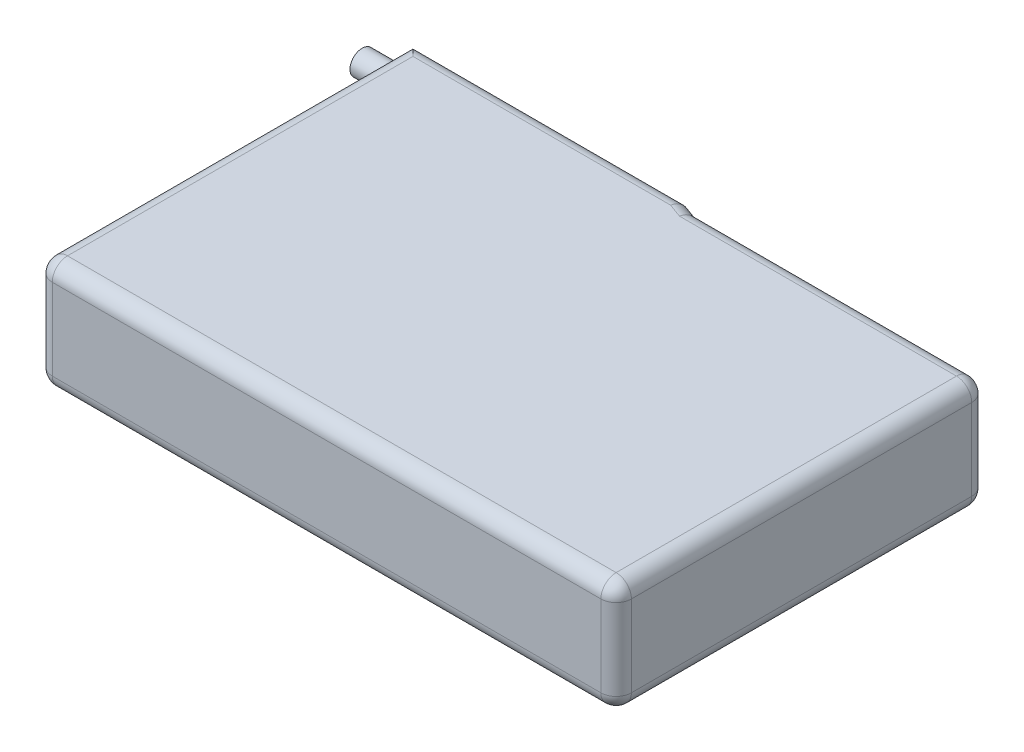
ISO-10303-21;
HEADER;
FILE_DESCRIPTION(('STEP AP214'),'2;1');
FILE_NAME('part.step','',(''),(''),'','','');
FILE_SCHEMA(('AUTOMOTIVE_DESIGN { 1 0 10303 214 1 1 1 1 }'));
ENDSEC;
DATA;
#1=APPLICATION_CONTEXT('core data for automotive mechanical design processes');
#2=APPLICATION_PROTOCOL_DEFINITION('international standard','automotive_design',2000,#1);
#3=PRODUCT_CONTEXT('',#1,'mechanical');
#4=PRODUCT('Part','Part','',(#3));
#5=PRODUCT_RELATED_PRODUCT_CATEGORY('part','',(#4));
#6=PRODUCT_DEFINITION_FORMATION('','',#4);
#7=PRODUCT_DEFINITION_CONTEXT('part definition',#1,'design');
#8=PRODUCT_DEFINITION('design','',#6,#7);
#9=PRODUCT_DEFINITION_SHAPE('','',#8);
#10=(LENGTH_UNIT() NAMED_UNIT(*) SI_UNIT(.MILLI.,.METRE.));
#11=(NAMED_UNIT(*) PLANE_ANGLE_UNIT() SI_UNIT($,.RADIAN.));
#12=(NAMED_UNIT(*) SI_UNIT($,.STERADIAN.) SOLID_ANGLE_UNIT());
#13=UNCERTAINTY_MEASURE_WITH_UNIT(LENGTH_MEASURE(1.E-05),#10,'distance_accuracy_value','');
#14=(GEOMETRIC_REPRESENTATION_CONTEXT(3) GLOBAL_UNCERTAINTY_ASSIGNED_CONTEXT((#13)) GLOBAL_UNIT_ASSIGNED_CONTEXT((#10,
#11,#12)) REPRESENTATION_CONTEXT('',''));
#15=CARTESIAN_POINT('',(0.,0.,0.));
#16=DIRECTION('',(0.,0.,1.));
#17=DIRECTION('',(1.,0.,0.));
#18=AXIS2_PLACEMENT_3D('',#15,#16,#17);
#19=CARTESIAN_POINT('',(-28.5,11.,18.25));
#20=DIRECTION('',(1.,0.,0.));
#21=DIRECTION('',(0.,0.,-1.));
#22=AXIS2_PLACEMENT_3D('',#19,#20,#21);
#23=PLANE('',#22);
#24=CARTESIAN_POINT('',(-28.5,5.5,-16.75));
#25=DIRECTION('',(1.,0.,0.));
#26=DIRECTION('',(0.,0.,-1.));
#27=AXIS2_PLACEMENT_3D('',#24,#25,#26);
#28=CIRCLE('',#27,1.2);
#29=CARTESIAN_POINT('',(-28.5,5.5,-17.95));
#30=VERTEX_POINT('',#29);
#31=EDGE_CURVE('E194',#30,#30,#28,.F.);
#32=ORIENTED_EDGE('',*,*,#31,.F.);
#33=EDGE_LOOP('',(#32));
#34=FACE_BOUND('',#33,.T.);
#35=DIRECTION('',(0.,1.,0.));
#36=VECTOR('',#35,1.);
#37=CARTESIAN_POINT('',(-28.5,0.,-18.75));
#38=LINE('',#37,#36);
#39=CARTESIAN_POINT('',(-28.5,1.5,-18.75));
#40=VERTEX_POINT('',#39);
#41=CARTESIAN_POINT('',(-28.5,9.5,-18.75));
#42=VERTEX_POINT('',#41);
#43=EDGE_CURVE('E216',#40,#42,#38,.T.);
#44=ORIENTED_EDGE('',*,*,#43,.F.);
#45=DIRECTION('',(0.,0.,1.));
#46=VECTOR('',#45,1.);
#47=CARTESIAN_POINT('',(-28.5,1.5,18.25));
#48=LINE('',#47,#46);
#49=CARTESIAN_POINT('',(-28.5,1.5,-17.4133249580711));
#50=VERTEX_POINT('',#49);
#51=EDGE_CURVE('E209',#40,#50,#48,.T.);
#52=ORIENTED_EDGE('',*,*,#51,.T.);
#53=CARTESIAN_POINT('',(-28.5,2.5,-16.75));
#54=DIRECTION('',(1.,0.,0.));
#55=DIRECTION('',(0.,0.,-1.));
#56=AXIS2_PLACEMENT_3D('',#53,#54,#55);
#57=CIRCLE('',#56,1.2);
#58=CARTESIAN_POINT('',(-28.5,1.5,-16.0866750419289));
#59=VERTEX_POINT('',#58);
#60=EDGE_CURVE('E191',#59,#50,#57,.F.);
#61=ORIENTED_EDGE('',*,*,#60,.F.);
#62=DIRECTION('',(0.,0.,1.));
#63=VECTOR('',#62,1.);
#64=CARTESIAN_POINT('',(-28.5,1.5,18.25));
#65=LINE('',#64,#63);
#66=CARTESIAN_POINT('',(-28.5,1.5,16.75));
#67=VERTEX_POINT('',#66);
#68=EDGE_CURVE('E207',#59,#67,#65,.T.);
#69=ORIENTED_EDGE('',*,*,#68,.T.);
#70=DIRECTION('',(0.,-1.,0.));
#71=VECTOR('',#70,1.);
#72=CARTESIAN_POINT('',(-28.5,11.,16.75));
#73=LINE('',#72,#71);
#74=CARTESIAN_POINT('',(-28.5,9.5,16.75));
#75=VERTEX_POINT('',#74);
#76=EDGE_CURVE('E204',#67,#75,#73,.F.);
#77=ORIENTED_EDGE('',*,*,#76,.T.);
#78=DIRECTION('',(0.,0.,1.));
#79=VECTOR('',#78,1.);
#80=CARTESIAN_POINT('',(-28.5,9.5,-18.75));
#81=LINE('',#80,#79);
#82=CARTESIAN_POINT('',(-28.5,9.5,-16.0866750419289));
#83=VERTEX_POINT('',#82);
#84=EDGE_CURVE('E202',#75,#83,#81,.F.);
#85=ORIENTED_EDGE('',*,*,#84,.T.);
#86=CARTESIAN_POINT('',(-28.5,8.5,-16.75));
#87=DIRECTION('',(1.,0.,0.));
#88=DIRECTION('',(0.,0.,-1.));
#89=AXIS2_PLACEMENT_3D('',#86,#87,#88);
#90=CIRCLE('',#89,1.2);
#91=CARTESIAN_POINT('',(-28.5,9.5,-17.4133249580711));
#92=VERTEX_POINT('',#91);
#93=EDGE_CURVE('E226',#92,#83,#90,.F.);
#94=ORIENTED_EDGE('',*,*,#93,.F.);
#95=DIRECTION('',(0.,0.,1.));
#96=VECTOR('',#95,1.);
#97=CARTESIAN_POINT('',(-28.5,9.5,-18.75));
#98=LINE('',#97,#96);
#99=EDGE_CURVE('E200',#92,#42,#98,.F.);
#100=ORIENTED_EDGE('',*,*,#99,.T.);
#101=EDGE_LOOP('',(#44,#52,#61,#69,#77,#85,#94,#100));
#102=FACE_BOUND('',#101,.T.);
#103=ADVANCED_FACE('F32',(#34,#102),#23,.F.);
#104=CARTESIAN_POINT('',(28.5,11.,-18.25));
#105=DIRECTION('',(0.,0.,1.));
#106=DIRECTION('',(1.,0.,0.));
#107=AXIS2_PLACEMENT_3D('',#104,#105,#106);
#108=PLANE('',#107);
#109=DIRECTION('',(0.,-1.,0.));
#110=VECTOR('',#109,1.);
#111=CARTESIAN_POINT('',(27.,11.,-18.25));
#112=LINE('',#111,#110);
#113=CARTESIAN_POINT('',(27.,9.5,-18.25));
#114=VERTEX_POINT('',#113);
#115=CARTESIAN_POINT('',(27.,1.5,-18.25));
#116=VERTEX_POINT('',#115);
#117=EDGE_CURVE('E516',#114,#116,#112,.T.);
#118=ORIENTED_EDGE('',*,*,#117,.T.);
#119=DIRECTION('',(-1.,0.,0.));
#120=VECTOR('',#119,1.);
#121=CARTESIAN_POINT('',(28.5,1.5,-18.25));
#122=LINE('',#121,#120);
#123=CARTESIAN_POINT('',(0.,1.5,-18.25));
#124=VERTEX_POINT('',#123);
#125=EDGE_CURVE('E514',#116,#124,#122,.T.);
#126=ORIENTED_EDGE('',*,*,#125,.T.);
#127=DIRECTION('',(0.,-1.,0.));
#128=VECTOR('',#127,1.);
#129=CARTESIAN_POINT('',(0.,0.,-18.25));
#130=LINE('',#129,#128);
#131=CARTESIAN_POINT('',(0.,9.5,-18.25));
#132=VERTEX_POINT('',#131);
#133=EDGE_CURVE('E212',#132,#124,#130,.T.);
#134=ORIENTED_EDGE('',*,*,#133,.F.);
#135=DIRECTION('',(-1.,0.,0.));
#136=VECTOR('',#135,1.);
#137=CARTESIAN_POINT('',(28.5,9.5,-18.25));
#138=LINE('',#137,#136);
#139=EDGE_CURVE('E211',#132,#114,#138,.F.);
#140=ORIENTED_EDGE('',*,*,#139,.T.);
#141=EDGE_LOOP('',(#118,#126,#134,#140));
#142=FACE_BOUND('',#141,.T.);
#143=ADVANCED_FACE('F235',(#142),#108,.F.);
#144=CARTESIAN_POINT('',(28.5,11.,18.25));
#145=DIRECTION('',(0.,0.,-1.));
#146=DIRECTION('',(-1.,0.,0.));
#147=AXIS2_PLACEMENT_3D('',#144,#145,#146);
#148=PLANE('',#147);
#149=DIRECTION('',(0.,-1.,0.));
#150=VECTOR('',#149,1.);
#151=CARTESIAN_POINT('',(-27.,11.,18.25));
#152=LINE('',#151,#150);
#153=CARTESIAN_POINT('',(-27.,9.5,18.25));
#154=VERTEX_POINT('',#153);
#155=CARTESIAN_POINT('',(-27.,1.5,18.25));
#156=VERTEX_POINT('',#155);
#157=EDGE_CURVE('E165',#154,#156,#152,.T.);
#158=ORIENTED_EDGE('',*,*,#157,.T.);
#159=DIRECTION('',(1.,0.,0.));
#160=VECTOR('',#159,1.);
#161=CARTESIAN_POINT('',(28.5,1.5,18.25));
#162=LINE('',#161,#160);
#163=CARTESIAN_POINT('',(27.,1.5,18.25));
#164=VERTEX_POINT('',#163);
#165=EDGE_CURVE('E161',#156,#164,#162,.T.);
#166=ORIENTED_EDGE('',*,*,#165,.T.);
#167=DIRECTION('',(0.,-1.,0.));
#168=VECTOR('',#167,1.);
#169=CARTESIAN_POINT('',(27.,11.,18.25));
#170=LINE('',#169,#168);
#171=CARTESIAN_POINT('',(27.,9.5,18.25));
#172=VERTEX_POINT('',#171);
#173=EDGE_CURVE('E153',#164,#172,#170,.F.);
#174=ORIENTED_EDGE('',*,*,#173,.T.);
#175=DIRECTION('',(1.,0.,0.));
#176=VECTOR('',#175,1.);
#177=CARTESIAN_POINT('',(-28.5,9.5,18.25));
#178=LINE('',#177,#176);
#179=EDGE_CURVE('E158',#172,#154,#178,.F.);
#180=ORIENTED_EDGE('',*,*,#179,.T.);
#181=EDGE_LOOP('',(#158,#166,#174,#180));
#182=FACE_BOUND('',#181,.T.);
#183=ADVANCED_FACE('F156',(#182),#148,.F.);
#184=CARTESIAN_POINT('',(28.5,11.,18.25));
#185=DIRECTION('',(-1.,0.,0.));
#186=DIRECTION('',(0.,0.,1.));
#187=AXIS2_PLACEMENT_3D('',#184,#185,#186);
#188=PLANE('',#187);
#189=DIRECTION('',(0.,-1.,0.));
#190=VECTOR('',#189,1.);
#191=CARTESIAN_POINT('',(28.5,11.,16.75));
#192=LINE('',#191,#190);
#193=CARTESIAN_POINT('',(28.5,9.5,16.75));
#194=VERTEX_POINT('',#193);
#195=CARTESIAN_POINT('',(28.5,1.5,16.75));
#196=VERTEX_POINT('',#195);
#197=EDGE_CURVE('E172',#194,#196,#192,.T.);
#198=ORIENTED_EDGE('',*,*,#197,.T.);
#199=DIRECTION('',(0.,0.,-1.));
#200=VECTOR('',#199,1.);
#201=CARTESIAN_POINT('',(28.5,1.5,18.25));
#202=LINE('',#201,#200);
#203=CARTESIAN_POINT('',(28.5,1.5,-16.75));
#204=VERTEX_POINT('',#203);
#205=EDGE_CURVE('E416',#196,#204,#202,.T.);
#206=ORIENTED_EDGE('',*,*,#205,.T.);
#207=DIRECTION('',(0.,-1.,0.));
#208=VECTOR('',#207,1.);
#209=CARTESIAN_POINT('',(28.5,11.,-16.75));
#210=LINE('',#209,#208);
#211=CARTESIAN_POINT('',(28.5,9.5,-16.75));
#212=VERTEX_POINT('',#211);
#213=EDGE_CURVE('E420',#204,#212,#210,.F.);
#214=ORIENTED_EDGE('',*,*,#213,.T.);
#215=DIRECTION('',(0.,0.,-1.));
#216=VECTOR('',#215,1.);
#217=CARTESIAN_POINT('',(28.5,9.5,18.25));
#218=LINE('',#217,#216);
#219=EDGE_CURVE('E517',#212,#194,#218,.F.);
#220=ORIENTED_EDGE('',*,*,#219,.T.);
#221=EDGE_LOOP('',(#198,#206,#214,#220));
#222=FACE_BOUND('',#221,.T.);
#223=ADVANCED_FACE('F470',(#222),#188,.F.);
#224=CARTESIAN_POINT('',(0.,11.,0.));
#225=DIRECTION('',(0.,1.,0.));
#226=DIRECTION('',(0.,0.,1.));
#227=AXIS2_PLACEMENT_3D('',#224,#225,#226);
#228=PLANE('',#227);
#229=DIRECTION('',(-1.,0.,0.));
#230=VECTOR('',#229,1.);
#231=CARTESIAN_POINT('',(0.,11.,-16.75));
#232=LINE('',#231,#230);
#233=CARTESIAN_POINT('',(27.,11.,-16.75));
#234=VERTEX_POINT('',#233);
#235=CARTESIAN_POINT('',(-0.264490471062663,11.,-16.75));
#236=VERTEX_POINT('',#235);
#237=EDGE_CURVE('E57',#234,#236,#232,.T.);
#238=ORIENTED_EDGE('',*,*,#237,.T.);
#239=DIRECTION('',(-0.939692620785909,0.,-0.342020143325668));
#240=VECTOR('',#239,1.);
#241=CARTESIAN_POINT('',(5.35240672340117,11.,-14.7056166122818));
#242=LINE('',#241,#240);
#243=CARTESIAN_POINT('',(-1.63822918078998,11.,-17.25));
#244=VERTEX_POINT('',#243);
#245=EDGE_CURVE('E264',#236,#244,#242,.T.);
#246=ORIENTED_EDGE('',*,*,#245,.T.);
#247=DIRECTION('',(1.,0.,0.));
#248=VECTOR('',#247,1.);
#249=CARTESIAN_POINT('',(0.,11.,-17.25));
#250=LINE('',#249,#248);
#251=CARTESIAN_POINT('',(-27.,11.,-17.25));
#252=VERTEX_POINT('',#251);
#253=EDGE_CURVE('E49',#244,#252,#250,.F.);
#254=ORIENTED_EDGE('',*,*,#253,.T.);
#255=DIRECTION('',(0.,0.,1.));
#256=VECTOR('',#255,1.);
#257=CARTESIAN_POINT('',(-27.,11.,18.25));
#258=LINE('',#257,#256);
#259=CARTESIAN_POINT('',(-27.,11.,16.75));
#260=VERTEX_POINT('',#259);
#261=EDGE_CURVE('E440',#252,#260,#258,.T.);
#262=ORIENTED_EDGE('',*,*,#261,.T.);
#263=DIRECTION('',(1.,0.,0.));
#264=VECTOR('',#263,1.);
#265=CARTESIAN_POINT('',(28.5,11.,16.75));
#266=LINE('',#265,#264);
#267=CARTESIAN_POINT('',(27.,11.,16.75));
#268=VERTEX_POINT('',#267);
#269=EDGE_CURVE('E442',#260,#268,#266,.T.);
#270=ORIENTED_EDGE('',*,*,#269,.T.);
#271=DIRECTION('',(0.,0.,-1.));
#272=VECTOR('',#271,1.);
#273=CARTESIAN_POINT('',(27.,11.,-18.25));
#274=LINE('',#273,#272);
#275=EDGE_CURVE('E444',#268,#234,#274,.T.);
#276=ORIENTED_EDGE('',*,*,#275,.T.);
#277=EDGE_LOOP('',(#238,#246,#254,#262,#270,#276));
#278=FACE_BOUND('',#277,.T.);
#279=ADVANCED_FACE('F446',(#278),#228,.T.);
#280=CARTESIAN_POINT('',(0.,0.,0.));
#281=DIRECTION('',(0.,1.,0.));
#282=DIRECTION('',(0.,0.,1.));
#283=AXIS2_PLACEMENT_3D('',#280,#281,#282);
#284=PLANE('',#283);
#285=DIRECTION('',(0.,0.,-1.));
#286=VECTOR('',#285,1.);
#287=CARTESIAN_POINT('',(27.,0.,0.));
#288=LINE('',#287,#286);
#289=CARTESIAN_POINT('',(27.,0.,-16.75));
#290=VERTEX_POINT('',#289);
#291=CARTESIAN_POINT('',(27.,0.,16.75));
#292=VERTEX_POINT('',#291);
#293=EDGE_CURVE('E415',#290,#292,#288,.F.);
#294=ORIENTED_EDGE('',*,*,#293,.T.);
#295=DIRECTION('',(1.,0.,0.));
#296=VECTOR('',#295,1.);
#297=CARTESIAN_POINT('',(0.,0.,16.75));
#298=LINE('',#297,#296);
#299=CARTESIAN_POINT('',(-27.,0.,16.75));
#300=VERTEX_POINT('',#299);
#301=EDGE_CURVE('E411',#292,#300,#298,.F.);
#302=ORIENTED_EDGE('',*,*,#301,.T.);
#303=DIRECTION('',(0.,0.,1.));
#304=VECTOR('',#303,1.);
#305=CARTESIAN_POINT('',(-27.,0.,0.));
#306=LINE('',#305,#304);
#307=CARTESIAN_POINT('',(-27.,0.,-17.25));
#308=VERTEX_POINT('',#307);
#309=EDGE_CURVE('E429',#300,#308,#306,.F.);
#310=ORIENTED_EDGE('',*,*,#309,.T.);
#311=DIRECTION('',(-1.,0.,0.));
#312=VECTOR('',#311,1.);
#313=CARTESIAN_POINT('',(-1.37373870972737,0.,-17.25));
#314=LINE('',#313,#312);
#315=CARTESIAN_POINT('',(-1.63822918078998,0.,-17.25));
#316=VERTEX_POINT('',#315);
#317=EDGE_CURVE('E254',#308,#316,#314,.F.);
#318=ORIENTED_EDGE('',*,*,#317,.T.);
#319=DIRECTION('',(0.939692620785909,0.,0.342020143325668));
#320=VECTOR('',#319,1.);
#321=CARTESIAN_POINT('',(-0.513030214988394,0.,-16.8404610688211));
#322=LINE('',#321,#320);
#323=CARTESIAN_POINT('',(-0.264490471062667,0.,-16.75));
#324=VERTEX_POINT('',#323);
#325=EDGE_CURVE('E419',#316,#324,#322,.T.);
#326=ORIENTED_EDGE('',*,*,#325,.T.);
#327=DIRECTION('',(-1.,0.,0.));
#328=VECTOR('',#327,1.);
#329=CARTESIAN_POINT('',(0.,0.,-16.75));
#330=LINE('',#329,#328);
#331=EDGE_CURVE('E422',#324,#290,#330,.F.);
#332=ORIENTED_EDGE('',*,*,#331,.T.);
#333=EDGE_LOOP('',(#294,#302,#310,#318,#326,#332));
#334=FACE_BOUND('',#333,.T.);
#335=ADVANCED_FACE('F476',(#334),#284,.F.);
#336=CARTESIAN_POINT('',(0.,0.,-18.75));
#337=DIRECTION('',(0.,0.,-1.));
#338=DIRECTION('',(-1.,0.,0.));
#339=AXIS2_PLACEMENT_3D('',#336,#337,#338);
#340=PLANE('',#339);
#341=DIRECTION('',(0.,-1.,0.));
#342=VECTOR('',#341,1.);
#343=CARTESIAN_POINT('',(-1.37373870972729,0.,-18.75));
#344=LINE('',#343,#342);
#345=CARTESIAN_POINT('',(-1.37373870972729,9.5,-18.75));
#346=VERTEX_POINT('',#345);
#347=CARTESIAN_POINT('',(-1.37373870972729,1.5,-18.75));
#348=VERTEX_POINT('',#347);
#349=EDGE_CURVE('E223',#346,#348,#344,.T.);
#350=ORIENTED_EDGE('',*,*,#349,.T.);
#351=DIRECTION('',(-1.,0.,0.));
#352=VECTOR('',#351,1.);
#353=CARTESIAN_POINT('',(-28.5,1.5,-18.75));
#354=LINE('',#353,#352);
#355=EDGE_CURVE('E253',#348,#40,#354,.T.);
#356=ORIENTED_EDGE('',*,*,#355,.T.);
#357=ORIENTED_EDGE('',*,*,#43,.T.);
#358=DIRECTION('',(1.,0.,0.));
#359=VECTOR('',#358,1.);
#360=CARTESIAN_POINT('',(0.,9.5,-18.75));
#361=LINE('',#360,#359);
#362=EDGE_CURVE('E433',#42,#346,#361,.T.);
#363=ORIENTED_EDGE('',*,*,#362,.T.);
#364=EDGE_LOOP('',(#350,#356,#357,#363));
#365=FACE_BOUND('',#364,.T.);
#366=ADVANCED_FACE('F465',(#365),#340,.T.);
#367=CARTESIAN_POINT('',(-1.37373870972729,0.,-18.75));
#368=DIRECTION('',(0.342020143325668,0.,-0.939692620785908));
#369=DIRECTION('',(0.,1.,0.));
#370=AXIS2_PLACEMENT_3D('',#367,#368,#369);
#371=PLANE('',#370);
#372=ORIENTED_EDGE('',*,*,#133,.T.);
#373=DIRECTION('',(0.939692620785909,0.,0.342020143325668));
#374=VECTOR('',#373,1.);
#375=CARTESIAN_POINT('',(-1.37373870972737,1.5,-18.75));
#376=LINE('',#375,#374);
#377=EDGE_CURVE('E438',#124,#348,#376,.F.);
#378=ORIENTED_EDGE('',*,*,#377,.T.);
#379=ORIENTED_EDGE('',*,*,#349,.F.);
#380=DIRECTION('',(-0.939692620785909,0.,-0.342020143325668));
#381=VECTOR('',#380,1.);
#382=CARTESIAN_POINT('',(-1.37373870972729,9.5,-18.75));
#383=LINE('',#382,#381);
#384=EDGE_CURVE('E436',#346,#132,#383,.F.);
#385=ORIENTED_EDGE('',*,*,#384,.T.);
#386=EDGE_LOOP('',(#372,#378,#379,#385));
#387=FACE_BOUND('',#386,.T.);
#388=ADVANCED_FACE('F462',(#387),#371,.T.);
#389=CARTESIAN_POINT('',(-31.5,8.5,-16.75));
#390=DIRECTION('',(1.,0.,0.));
#391=DIRECTION('',(0.,0.,-1.));
#392=AXIS2_PLACEMENT_3D('',#389,#390,#391);
#393=CYLINDRICAL_SURFACE('',#392,1.2);
#394=CARTESIAN_POINT('',(-31.5,8.5,-16.75));
#395=DIRECTION('',(-1.,0.,0.));
#396=DIRECTION('',(0.,0.,1.));
#397=AXIS2_PLACEMENT_3D('',#394,#395,#396);
#398=CIRCLE('',#397,1.2);
#399=CARTESIAN_POINT('',(-31.5,8.5,-15.55));
#400=VERTEX_POINT('',#399);
#401=EDGE_CURVE('E217',#400,#400,#398,.T.);
#402=ORIENTED_EDGE('',*,*,#401,.F.);
#403=EDGE_LOOP('',(#402));
#404=FACE_BOUND('',#403,.T.);
#405=ORIENTED_EDGE('',*,*,#93,.T.);
#406=CARTESIAN_POINT('',(-28.5,9.5,-16.0866750419289));
#407=CARTESIAN_POINT('',(-28.4999971779372,9.51862973853937,-16.1147606563416));
#408=CARTESIAN_POINT('',(-28.4996534699341,9.5360647440399,-16.1436147337834));
#409=CARTESIAN_POINT('',(-28.4985256603221,9.56844317087682,-16.2026754085087));
#410=CARTESIAN_POINT('',(-28.4977416228034,9.58338695440143,-16.2328818083723));
#411=CARTESIAN_POINT('',(-28.4950930787486,9.62430038953192,-16.3251853214275));
#412=CARTESIAN_POINT('',(-28.4929308749607,9.64640119242289,-16.3890408935906));
#413=CARTESIAN_POINT('',(-28.489304544467,9.67959252640808,-16.5195597289365));
#414=CARTESIAN_POINT('',(-28.4878406213687,9.69067984716709,-16.5862238048745));
#415=CARTESIAN_POINT('',(-28.4864116314396,9.70152358983364,-16.7204818124976));
#416=CARTESIAN_POINT('',(-28.4864462043973,9.70128273483014,-16.7880755168113));
#417=CARTESIAN_POINT('',(-28.4879917932335,9.68950955369436,-16.9219537071292));
#418=CARTESIAN_POINT('',(-28.4894966298984,9.67802448425089,-16.9882424882068));
#419=CARTESIAN_POINT('',(-28.4931527482215,9.64415976586873,-17.1179425649412));
#420=CARTESIAN_POINT('',(-28.4953035847276,9.62178761255031,-17.1813558075804));
#421=CARTESIAN_POINT('',(-28.4978735878625,9.58093721421196,-17.2721510115689));
#422=CARTESIAN_POINT('',(-28.4986150593396,9.56634938467175,-17.3013281130216));
#423=CARTESIAN_POINT('',(-28.4996766858857,9.534876180661,-17.3583490541529));
#424=CARTESIAN_POINT('',(-28.4999976575134,9.51799532955678,-17.3861953763655));
#425=CARTESIAN_POINT('',(-28.5,9.5,-17.4133249580711));
#426=B_SPLINE_CURVE_WITH_KNOTS('',3,(#406,#407,#408,#409,#410,#411,#412,#413,#414,#415,#416,
#417,#418,#419,#420,#421,#422,#423,#424,#425),.UNSPECIFIED.,.F.,.F.,(4,2,2,2,2,2,2,2,2,4),(0.,
0.101038931572117,0.202063160685652,0.403848271099965,0.605692182891395,0.807487575297917,
1.0084384957318,1.20925125930681,1.30704356447679,1.40464568623811),.UNSPECIFIED.);
#427=EDGE_CURVE('E11',#83,#92,#426,.T.);
#428=ORIENTED_EDGE('',*,*,#427,.T.);
#429=EDGE_LOOP('',(#405,#428));
#430=FACE_BOUND('',#429,.T.);
#431=ADVANCED_FACE('F464',(#404,#430),#393,.T.);
#432=CARTESIAN_POINT('',(-31.5,8.5,-16.75));
#433=DIRECTION('',(-1.,0.,0.));
#434=DIRECTION('',(0.,0.,1.));
#435=AXIS2_PLACEMENT_3D('',#432,#433,#434);
#436=PLANE('',#435);
#437=ORIENTED_EDGE('',*,*,#401,.T.);
#438=EDGE_LOOP('',(#437));
#439=FACE_BOUND('',#438,.T.);
#440=ADVANCED_FACE('F486',(#439),#436,.T.);
#441=CARTESIAN_POINT('',(-31.5,5.5,-16.75));
#442=DIRECTION('',(1.,0.,0.));
#443=DIRECTION('',(0.,0.,-1.));
#444=AXIS2_PLACEMENT_3D('',#441,#442,#443);
#445=CYLINDRICAL_SURFACE('',#444,1.2);
#446=CARTESIAN_POINT('',(-31.5,5.5,-16.75));
#447=DIRECTION('',(-1.,0.,0.));
#448=DIRECTION('',(0.,0.,1.));
#449=AXIS2_PLACEMENT_3D('',#446,#447,#448);
#450=CIRCLE('',#449,1.2);
#451=CARTESIAN_POINT('',(-31.5,5.5,-15.55));
#452=VERTEX_POINT('',#451);
#453=EDGE_CURVE('E502',#452,#452,#450,.T.);
#454=ORIENTED_EDGE('',*,*,#453,.F.);
#455=EDGE_LOOP('',(#454));
#456=FACE_BOUND('',#455,.T.);
#457=ORIENTED_EDGE('',*,*,#31,.T.);
#458=EDGE_LOOP('',(#457));
#459=FACE_BOUND('',#458,.T.);
#460=ADVANCED_FACE('F231',(#456,#459),#445,.T.);
#461=CARTESIAN_POINT('',(-31.5,5.5,-16.75));
#462=DIRECTION('',(-1.,0.,0.));
#463=DIRECTION('',(0.,0.,1.));
#464=AXIS2_PLACEMENT_3D('',#461,#462,#463);
#465=PLANE('',#464);
#466=ORIENTED_EDGE('',*,*,#453,.T.);
#467=EDGE_LOOP('',(#466));
#468=FACE_BOUND('',#467,.T.);
#469=ADVANCED_FACE('F492',(#468),#465,.T.);
#470=CARTESIAN_POINT('',(-31.5,2.5,-16.75));
#471=DIRECTION('',(1.,0.,0.));
#472=DIRECTION('',(0.,0.,-1.));
#473=AXIS2_PLACEMENT_3D('',#470,#471,#472);
#474=CYLINDRICAL_SURFACE('',#473,1.2);
#475=CARTESIAN_POINT('',(-31.5,2.5,-16.75));
#476=DIRECTION('',(-1.,0.,0.));
#477=DIRECTION('',(0.,0.,1.));
#478=AXIS2_PLACEMENT_3D('',#475,#476,#477);
#479=CIRCLE('',#478,1.2);
#480=CARTESIAN_POINT('',(-31.5,2.5,-15.55));
#481=VERTEX_POINT('',#480);
#482=EDGE_CURVE('E354',#481,#481,#479,.T.);
#483=ORIENTED_EDGE('',*,*,#482,.F.);
#484=EDGE_LOOP('',(#483));
#485=FACE_BOUND('',#484,.T.);
#486=ORIENTED_EDGE('',*,*,#60,.T.);
#487=CARTESIAN_POINT('',(-28.5,1.5,-17.4133249580711));
#488=CARTESIAN_POINT('',(-28.4999971779372,1.48137026146063,-17.3852393436584));
#489=CARTESIAN_POINT('',(-28.4996534699341,1.46393525596009,-17.3563852662166));
#490=CARTESIAN_POINT('',(-28.4985256603221,1.43155682912318,-17.2973245914913));
#491=CARTESIAN_POINT('',(-28.4977416228034,1.41661304559857,-17.2671181916277));
#492=CARTESIAN_POINT('',(-28.4950930787486,1.37569961046808,-17.1748146785725));
#493=CARTESIAN_POINT('',(-28.4929308749607,1.35359880757711,-17.1109591064093));
#494=CARTESIAN_POINT('',(-28.489304544467,1.32040747359192,-16.9804402710635));
#495=CARTESIAN_POINT('',(-28.4878406213687,1.30932015283291,-16.9137761951255));
#496=CARTESIAN_POINT('',(-28.4864116314396,1.29847641016636,-16.7795181875024));
#497=CARTESIAN_POINT('',(-28.4864462043973,1.29871726516986,-16.7119244831887));
#498=CARTESIAN_POINT('',(-28.4879917932335,1.31049044630564,-16.5780462928708));
#499=CARTESIAN_POINT('',(-28.4894966298984,1.32197551574911,-16.5117575117932));
#500=CARTESIAN_POINT('',(-28.4931527482215,1.35584023413127,-16.3820574350587));
#501=CARTESIAN_POINT('',(-28.4953035847276,1.37821238744969,-16.3186441924195));
#502=CARTESIAN_POINT('',(-28.4978735878625,1.41906278578804,-16.2278489884311));
#503=CARTESIAN_POINT('',(-28.4986150593396,1.43365061532825,-16.1986718869783));
#504=CARTESIAN_POINT('',(-28.4996766858857,1.465123819339,-16.1416509458471));
#505=CARTESIAN_POINT('',(-28.4999976575134,1.48200467044322,-16.1138046236344));
#506=CARTESIAN_POINT('',(-28.5,1.5,-16.0866750419289));
#507=B_SPLINE_CURVE_WITH_KNOTS('',3,(#487,#488,#489,#490,#491,#492,#493,#494,#495,#496,#497,
#498,#499,#500,#501,#502,#503,#504,#505,#506),.UNSPECIFIED.,.F.,.F.,(4,2,2,2,2,2,2,2,2,4),(0.,
0.101038931572116,0.202063160685651,0.403848271099965,0.605692182891395,0.807487575297916,
1.00843849573181,1.20925125930681,1.30704356447679,1.40464568623811),.UNSPECIFIED.);
#508=EDGE_CURVE('E41',#50,#59,#507,.T.);
#509=ORIENTED_EDGE('',*,*,#508,.T.);
#510=EDGE_LOOP('',(#486,#509));
#511=FACE_BOUND('',#510,.T.);
#512=ADVANCED_FACE('F279',(#485,#511),#474,.T.);
#513=CARTESIAN_POINT('',(-31.5,2.5,-16.75));
#514=DIRECTION('',(-1.,0.,0.));
#515=DIRECTION('',(0.,0.,1.));
#516=AXIS2_PLACEMENT_3D('',#513,#514,#515);
#517=PLANE('',#516);
#518=ORIENTED_EDGE('',*,*,#482,.T.);
#519=EDGE_LOOP('',(#518));
#520=FACE_BOUND('',#519,.T.);
#521=ADVANCED_FACE('F345',(#520),#517,.T.);
#522=CARTESIAN_POINT('',(27.,11.,-16.75));
#523=DIRECTION('',(0.,-1.,0.));
#524=DIRECTION('',(0.,0.,-1.));
#525=AXIS2_PLACEMENT_3D('',#522,#523,#524);
#526=CYLINDRICAL_SURFACE('',#525,1.5);
#527=CARTESIAN_POINT('',(27.,1.5,-16.75));
#528=DIRECTION('',(0.,-1.,0.));
#529=DIRECTION('',(0.,0.,-1.));
#530=AXIS2_PLACEMENT_3D('',#527,#528,#529);
#531=CIRCLE('',#530,1.5);
#532=EDGE_CURVE('E361',#116,#204,#531,.T.);
#533=ORIENTED_EDGE('',*,*,#532,.F.);
#534=ORIENTED_EDGE('',*,*,#117,.F.);
#535=CARTESIAN_POINT('',(27.,9.5,-16.75));
#536=DIRECTION('',(0.,1.,0.));
#537=DIRECTION('',(0.,0.,1.));
#538=AXIS2_PLACEMENT_3D('',#535,#536,#537);
#539=CIRCLE('',#538,1.5);
#540=EDGE_CURVE('E355',#212,#114,#539,.T.);
#541=ORIENTED_EDGE('',*,*,#540,.F.);
#542=ORIENTED_EDGE('',*,*,#213,.F.);
#543=EDGE_LOOP('',(#533,#534,#541,#542));
#544=FACE_BOUND('',#543,.T.);
#545=ADVANCED_FACE('F34',(#544),#526,.T.);
#546=CARTESIAN_POINT('',(0.,9.5,-16.75));
#547=DIRECTION('',(1.,0.,0.));
#548=DIRECTION('',(0.,0.,-1.));
#549=AXIS2_PLACEMENT_3D('',#546,#547,#548);
#550=CYLINDRICAL_SURFACE('',#549,1.5);
#551=CARTESIAN_POINT('',(27.,9.5,-16.75));
#552=DIRECTION('',(1.,0.,0.));
#553=DIRECTION('',(0.,0.,-1.));
#554=AXIS2_PLACEMENT_3D('',#551,#552,#553);
#555=CIRCLE('',#554,1.5);
#556=EDGE_CURVE('E36',#114,#234,#555,.T.);
#557=ORIENTED_EDGE('',*,*,#556,.F.);
#558=ORIENTED_EDGE('',*,*,#139,.F.);
#559=CARTESIAN_POINT('',(-0.264490471062665,9.5,-16.75));
#560=DIRECTION('',(-0.984807753012208,0.,-0.17364817766693));
#561=DIRECTION('',(0.17364817766693,0.,-0.984807753012208));
#562=AXIS2_PLACEMENT_3D('',#559,#560,#561);
#563=ELLIPSE('',#562,1.52313991782862,1.5);
#564=EDGE_CURVE('E368',#236,#132,#563,.T.);
#565=ORIENTED_EDGE('',*,*,#564,.F.);
#566=ORIENTED_EDGE('',*,*,#237,.F.);
#567=EDGE_LOOP('',(#557,#558,#565,#566));
#568=FACE_BOUND('',#567,.T.);
#569=ADVANCED_FACE('F338',(#568),#550,.T.);
#570=CARTESIAN_POINT('',(27.,9.5,-16.75));
#571=DIRECTION('',(0.,0.,1.));
#572=DIRECTION('',(1.,0.,0.));
#573=AXIS2_PLACEMENT_3D('',#570,#571,#572);
#574=SPHERICAL_SURFACE('',#573,1.5);
#575=ORIENTED_EDGE('',*,*,#540,.T.);
#576=ORIENTED_EDGE('',*,*,#556,.T.);
#577=CARTESIAN_POINT('',(27.,9.5,-16.75));
#578=DIRECTION('',(0.,0.,-1.));
#579=DIRECTION('',(-1.,0.,0.));
#580=AXIS2_PLACEMENT_3D('',#577,#578,#579);
#581=CIRCLE('',#580,1.5);
#582=EDGE_CURVE('E357',#212,#234,#581,.F.);
#583=ORIENTED_EDGE('',*,*,#582,.F.);
#584=EDGE_LOOP('',(#575,#576,#583));
#585=FACE_BOUND('',#584,.T.);
#586=ADVANCED_FACE('F335',(#585),#574,.T.);
#587=CARTESIAN_POINT('',(27.,1.5,-16.75));
#588=DIRECTION('',(0.,0.,1.));
#589=DIRECTION('',(1.,0.,0.));
#590=AXIS2_PLACEMENT_3D('',#587,#588,#589);
#591=SPHERICAL_SURFACE('',#590,1.5);
#592=CARTESIAN_POINT('',(27.,1.5,-16.75));
#593=DIRECTION('',(0.,0.,-1.));
#594=DIRECTION('',(-1.,0.,0.));
#595=AXIS2_PLACEMENT_3D('',#592,#593,#594);
#596=CIRCLE('',#595,1.5);
#597=EDGE_CURVE('E371',#290,#204,#596,.F.);
#598=ORIENTED_EDGE('',*,*,#597,.F.);
#599=CARTESIAN_POINT('',(27.,1.5,-16.75));
#600=DIRECTION('',(1.,0.,0.));
#601=DIRECTION('',(0.,0.,-1.));
#602=AXIS2_PLACEMENT_3D('',#599,#600,#601);
#603=CIRCLE('',#602,1.5);
#604=EDGE_CURVE('E363',#116,#290,#603,.F.);
#605=ORIENTED_EDGE('',*,*,#604,.F.);
#606=ORIENTED_EDGE('',*,*,#532,.T.);
#607=EDGE_LOOP('',(#598,#605,#606));
#608=FACE_BOUND('',#607,.T.);
#609=ADVANCED_FACE('F331',(#608),#591,.T.);
#610=CARTESIAN_POINT('',(28.5,1.5,-16.75));
#611=DIRECTION('',(-1.,0.,0.));
#612=DIRECTION('',(0.,0.,1.));
#613=AXIS2_PLACEMENT_3D('',#610,#611,#612);
#614=CYLINDRICAL_SURFACE('',#613,1.5);
#615=ORIENTED_EDGE('',*,*,#604,.T.);
#616=ORIENTED_EDGE('',*,*,#331,.F.);
#617=CARTESIAN_POINT('',(-0.264490471062586,1.5,-16.75));
#618=DIRECTION('',(-0.984807753012208,0.,-0.17364817766693));
#619=DIRECTION('',(-0.17364817766693,0.,0.984807753012208));
#620=AXIS2_PLACEMENT_3D('',#617,#618,#619);
#621=ELLIPSE('',#620,1.52313991782862,1.5);
#622=EDGE_CURVE('E374',#124,#324,#621,.T.);
#623=ORIENTED_EDGE('',*,*,#622,.F.);
#624=ORIENTED_EDGE('',*,*,#125,.F.);
#625=EDGE_LOOP('',(#615,#616,#623,#624));
#626=FACE_BOUND('',#625,.T.);
#627=ADVANCED_FACE('F327',(#626),#614,.T.);
#628=CARTESIAN_POINT('',(5.35240672340117,9.5,-14.7056166122818));
#629=DIRECTION('',(-0.939692620785909,0.,-0.342020143325668));
#630=DIRECTION('',(-0.342020143325668,0.,0.939692620785909));
#631=AXIS2_PLACEMENT_3D('',#628,#629,#630);
#632=CYLINDRICAL_SURFACE('',#631,1.5);
#633=ORIENTED_EDGE('',*,*,#564,.T.);
#634=ORIENTED_EDGE('',*,*,#384,.F.);
#635=CARTESIAN_POINT('',(-1.63822918078999,9.5,-17.25));
#636=DIRECTION('',(0.984807753012208,0.,0.17364817766693));
#637=DIRECTION('',(0.17364817766693,0.,-0.984807753012208));
#638=AXIS2_PLACEMENT_3D('',#635,#636,#637);
#639=ELLIPSE('',#638,1.52313991782862,1.5);
#640=EDGE_CURVE('E377',#244,#346,#639,.F.);
#641=ORIENTED_EDGE('',*,*,#640,.F.);
#642=ORIENTED_EDGE('',*,*,#245,.F.);
#643=EDGE_LOOP('',(#633,#634,#641,#642));
#644=FACE_BOUND('',#643,.T.);
#645=ADVANCED_FACE('F323',(#644),#632,.T.);
#646=CARTESIAN_POINT('',(27.,9.5,0.));
#647=DIRECTION('',(0.,0.,1.));
#648=DIRECTION('',(1.,0.,0.));
#649=AXIS2_PLACEMENT_3D('',#646,#647,#648);
#650=CYLINDRICAL_SURFACE('',#649,1.5);
#651=ORIENTED_EDGE('',*,*,#582,.T.);
#652=ORIENTED_EDGE('',*,*,#275,.F.);
#653=CARTESIAN_POINT('',(27.,9.5,16.75));
#654=DIRECTION('',(0.,0.,1.));
#655=DIRECTION('',(1.,0.,0.));
#656=AXIS2_PLACEMENT_3D('',#653,#654,#655);
#657=CIRCLE('',#656,1.5);
#658=EDGE_CURVE('E176',#194,#268,#657,.T.);
#659=ORIENTED_EDGE('',*,*,#658,.F.);
#660=ORIENTED_EDGE('',*,*,#219,.F.);
#661=EDGE_LOOP('',(#651,#652,#659,#660));
#662=FACE_BOUND('',#661,.T.);
#663=ADVANCED_FACE('F320',(#662),#650,.T.);
#664=CARTESIAN_POINT('',(27.,11.,16.75));
#665=DIRECTION('',(0.,-1.,0.));
#666=DIRECTION('',(0.,0.,-1.));
#667=AXIS2_PLACEMENT_3D('',#664,#665,#666);
#668=CYLINDRICAL_SURFACE('',#667,1.5);
#669=CARTESIAN_POINT('',(27.,1.5,16.75));
#670=DIRECTION('',(0.,-1.,0.));
#671=DIRECTION('',(0.,0.,-1.));
#672=AXIS2_PLACEMENT_3D('',#669,#670,#671);
#673=CIRCLE('',#672,1.5);
#674=EDGE_CURVE('E177',#196,#164,#673,.T.);
#675=ORIENTED_EDGE('',*,*,#674,.F.);
#676=ORIENTED_EDGE('',*,*,#197,.F.);
#677=CARTESIAN_POINT('',(27.,9.5,16.75));
#678=DIRECTION('',(0.,1.,0.));
#679=DIRECTION('',(0.,0.,1.));
#680=AXIS2_PLACEMENT_3D('',#677,#678,#679);
#681=CIRCLE('',#680,1.5);
#682=EDGE_CURVE('E169',#172,#194,#681,.T.);
#683=ORIENTED_EDGE('',*,*,#682,.F.);
#684=ORIENTED_EDGE('',*,*,#173,.F.);
#685=EDGE_LOOP('',(#675,#676,#683,#684));
#686=FACE_BOUND('',#685,.T.);
#687=ADVANCED_FACE('F171',(#686),#668,.T.);
#688=CARTESIAN_POINT('',(27.,1.5,18.25));
#689=DIRECTION('',(0.,0.,-1.));
#690=DIRECTION('',(-1.,0.,0.));
#691=AXIS2_PLACEMENT_3D('',#688,#689,#690);
#692=CYLINDRICAL_SURFACE('',#691,1.5);
#693=ORIENTED_EDGE('',*,*,#597,.T.);
#694=ORIENTED_EDGE('',*,*,#205,.F.);
#695=CARTESIAN_POINT('',(27.,1.5,16.75));
#696=DIRECTION('',(0.,0.,1.));
#697=DIRECTION('',(1.,0.,0.));
#698=AXIS2_PLACEMENT_3D('',#695,#696,#697);
#699=CIRCLE('',#698,1.5);
#700=EDGE_CURVE('E381',#292,#196,#699,.T.);
#701=ORIENTED_EDGE('',*,*,#700,.F.);
#702=ORIENTED_EDGE('',*,*,#293,.F.);
#703=EDGE_LOOP('',(#693,#694,#701,#702));
#704=FACE_BOUND('',#703,.T.);
#705=ADVANCED_FACE('F313',(#704),#692,.T.);
#706=CARTESIAN_POINT('',(5.35240672340117,1.5,-14.7056166122818));
#707=DIRECTION('',(-0.939692620785909,0.,-0.342020143325668));
#708=DIRECTION('',(-0.342020143325668,0.,0.939692620785909));
#709=AXIS2_PLACEMENT_3D('',#706,#707,#708);
#710=CYLINDRICAL_SURFACE('',#709,1.5);
#711=ORIENTED_EDGE('',*,*,#622,.T.);
#712=ORIENTED_EDGE('',*,*,#325,.F.);
#713=CARTESIAN_POINT('',(-1.63822918078997,1.5,-17.25));
#714=DIRECTION('',(-0.984807753012208,0.,-0.17364817766693));
#715=DIRECTION('',(0.17364817766693,0.,-0.984807753012208));
#716=AXIS2_PLACEMENT_3D('',#713,#714,#715);
#717=ELLIPSE('',#716,1.52313991782862,1.5);
#718=EDGE_CURVE('E384',#348,#316,#717,.T.);
#719=ORIENTED_EDGE('',*,*,#718,.F.);
#720=ORIENTED_EDGE('',*,*,#377,.F.);
#721=EDGE_LOOP('',(#711,#712,#719,#720));
#722=FACE_BOUND('',#721,.T.);
#723=ADVANCED_FACE('F310',(#722),#710,.T.);
#724=CARTESIAN_POINT('',(0.,9.5,-17.25));
#725=DIRECTION('',(1.,0.,0.));
#726=DIRECTION('',(0.,0.,-1.));
#727=AXIS2_PLACEMENT_3D('',#724,#725,#726);
#728=CYLINDRICAL_SURFACE('',#727,1.5);
#729=ORIENTED_EDGE('',*,*,#640,.T.);
#730=ORIENTED_EDGE('',*,*,#362,.F.);
#731=CARTESIAN_POINT('',(-27.,9.5,-17.25));
#732=DIRECTION('',(0.707106781186547,0.,-0.707106781186548));
#733=DIRECTION('',(-0.707106781186548,0.,-0.707106781186547));
#734=AXIS2_PLACEMENT_3D('',#731,#732,#733);
#735=ELLIPSE('',#734,2.12132034355964,1.5);
#736=EDGE_CURVE('E184',#252,#42,#735,.F.);
#737=ORIENTED_EDGE('',*,*,#736,.F.);
#738=ORIENTED_EDGE('',*,*,#253,.F.);
#739=EDGE_LOOP('',(#729,#730,#737,#738));
#740=FACE_BOUND('',#739,.T.);
#741=ADVANCED_FACE('F307',(#740),#728,.T.);
#742=CARTESIAN_POINT('',(27.,9.5,16.75));
#743=DIRECTION('',(0.,0.,1.));
#744=DIRECTION('',(1.,0.,0.));
#745=AXIS2_PLACEMENT_3D('',#742,#743,#744);
#746=SPHERICAL_SURFACE('',#745,1.5);
#747=ORIENTED_EDGE('',*,*,#682,.T.);
#748=ORIENTED_EDGE('',*,*,#658,.T.);
#749=CARTESIAN_POINT('',(27.,9.5,16.75));
#750=DIRECTION('',(1.,0.,0.));
#751=DIRECTION('',(0.,0.,-1.));
#752=AXIS2_PLACEMENT_3D('',#749,#750,#751);
#753=CIRCLE('',#752,1.5);
#754=EDGE_CURVE('E180',#172,#268,#753,.F.);
#755=ORIENTED_EDGE('',*,*,#754,.F.);
#756=EDGE_LOOP('',(#747,#748,#755));
#757=FACE_BOUND('',#756,.T.);
#758=ADVANCED_FACE('F181',(#757),#746,.T.);
#759=CARTESIAN_POINT('',(27.,1.5,16.75));
#760=DIRECTION('',(0.,0.,1.));
#761=DIRECTION('',(1.,0.,0.));
#762=AXIS2_PLACEMENT_3D('',#759,#760,#761);
#763=SPHERICAL_SURFACE('',#762,1.5);
#764=ORIENTED_EDGE('',*,*,#700,.T.);
#765=ORIENTED_EDGE('',*,*,#674,.T.);
#766=CARTESIAN_POINT('',(27.,1.5,16.75));
#767=DIRECTION('',(1.,0.,0.));
#768=DIRECTION('',(0.,0.,-1.));
#769=AXIS2_PLACEMENT_3D('',#766,#767,#768);
#770=CIRCLE('',#769,1.5);
#771=EDGE_CURVE('E185',#292,#164,#770,.F.);
#772=ORIENTED_EDGE('',*,*,#771,.F.);
#773=EDGE_LOOP('',(#764,#765,#772));
#774=FACE_BOUND('',#773,.T.);
#775=ADVANCED_FACE('F301',(#774),#763,.T.);
#776=CARTESIAN_POINT('',(0.,1.5,-17.25));
#777=DIRECTION('',(1.,0.,0.));
#778=DIRECTION('',(0.,0.,-1.));
#779=AXIS2_PLACEMENT_3D('',#776,#777,#778);
#780=CYLINDRICAL_SURFACE('',#779,1.5);
#781=ORIENTED_EDGE('',*,*,#718,.T.);
#782=ORIENTED_EDGE('',*,*,#317,.F.);
#783=CARTESIAN_POINT('',(-27.,1.5,-17.25));
#784=DIRECTION('',(0.707106781186547,0.,-0.707106781186548));
#785=DIRECTION('',(0.707106781186548,0.,0.707106781186547));
#786=AXIS2_PLACEMENT_3D('',#783,#784,#785);
#787=ELLIPSE('',#786,2.12132034355964,1.5);
#788=EDGE_CURVE('E250',#40,#308,#787,.F.);
#789=ORIENTED_EDGE('',*,*,#788,.F.);
#790=ORIENTED_EDGE('',*,*,#355,.F.);
#791=EDGE_LOOP('',(#781,#782,#789,#790));
#792=FACE_BOUND('',#791,.T.);
#793=ADVANCED_FACE('F252',(#792),#780,.T.);
#794=CARTESIAN_POINT('',(-27.,9.5,0.));
#795=DIRECTION('',(0.,0.,-1.));
#796=DIRECTION('',(-1.,0.,0.));
#797=AXIS2_PLACEMENT_3D('',#794,#795,#796);
#798=CYLINDRICAL_SURFACE('',#797,1.5);
#799=ORIENTED_EDGE('',*,*,#427,.F.);
#800=ORIENTED_EDGE('',*,*,#84,.F.);
#801=CARTESIAN_POINT('',(-27.,9.5,16.75));
#802=DIRECTION('',(0.,0.,1.));
#803=DIRECTION('',(1.,0.,0.));
#804=AXIS2_PLACEMENT_3D('',#801,#802,#803);
#805=CIRCLE('',#804,1.5);
#806=EDGE_CURVE('E257',#260,#75,#805,.T.);
#807=ORIENTED_EDGE('',*,*,#806,.F.);
#808=ORIENTED_EDGE('',*,*,#261,.F.);
#809=ORIENTED_EDGE('',*,*,#736,.T.);
#810=ORIENTED_EDGE('',*,*,#99,.F.);
#811=EDGE_LOOP('',(#799,#800,#807,#808,#809,#810));
#812=FACE_BOUND('',#811,.T.);
#813=ADVANCED_FACE('F294',(#812),#798,.T.);
#814=CARTESIAN_POINT('',(0.,9.5,16.75));
#815=DIRECTION('',(-1.,0.,0.));
#816=DIRECTION('',(0.,0.,1.));
#817=AXIS2_PLACEMENT_3D('',#814,#815,#816);
#818=CYLINDRICAL_SURFACE('',#817,1.5);
#819=ORIENTED_EDGE('',*,*,#754,.T.);
#820=ORIENTED_EDGE('',*,*,#269,.F.);
#821=CARTESIAN_POINT('',(-27.,9.5,16.75));
#822=DIRECTION('',(-1.,0.,0.));
#823=DIRECTION('',(0.,0.,1.));
#824=AXIS2_PLACEMENT_3D('',#821,#822,#823);
#825=CIRCLE('',#824,1.5);
#826=EDGE_CURVE('E189',#154,#260,#825,.T.);
#827=ORIENTED_EDGE('',*,*,#826,.F.);
#828=ORIENTED_EDGE('',*,*,#179,.F.);
#829=EDGE_LOOP('',(#819,#820,#827,#828));
#830=FACE_BOUND('',#829,.T.);
#831=ADVANCED_FACE('F187',(#830),#818,.T.);
#832=CARTESIAN_POINT('',(28.5,1.5,16.75));
#833=DIRECTION('',(1.,0.,0.));
#834=DIRECTION('',(0.,0.,-1.));
#835=AXIS2_PLACEMENT_3D('',#832,#833,#834);
#836=CYLINDRICAL_SURFACE('',#835,1.5);
#837=ORIENTED_EDGE('',*,*,#771,.T.);
#838=ORIENTED_EDGE('',*,*,#165,.F.);
#839=CARTESIAN_POINT('',(-27.,1.5,16.75));
#840=DIRECTION('',(-1.,0.,0.));
#841=DIRECTION('',(0.,0.,1.));
#842=AXIS2_PLACEMENT_3D('',#839,#840,#841);
#843=CIRCLE('',#842,1.5);
#844=EDGE_CURVE('E393',#300,#156,#843,.T.);
#845=ORIENTED_EDGE('',*,*,#844,.F.);
#846=ORIENTED_EDGE('',*,*,#301,.F.);
#847=EDGE_LOOP('',(#837,#838,#845,#846));
#848=FACE_BOUND('',#847,.T.);
#849=ADVANCED_FACE('F288',(#848),#836,.T.);
#850=CARTESIAN_POINT('',(-27.,1.5,18.25));
#851=DIRECTION('',(0.,0.,1.));
#852=DIRECTION('',(1.,0.,0.));
#853=AXIS2_PLACEMENT_3D('',#850,#851,#852);
#854=CYLINDRICAL_SURFACE('',#853,1.5);
#855=ORIENTED_EDGE('',*,*,#788,.T.);
#856=ORIENTED_EDGE('',*,*,#309,.F.);
#857=CARTESIAN_POINT('',(-27.,1.5,16.75));
#858=DIRECTION('',(0.,0.,1.));
#859=DIRECTION('',(1.,0.,0.));
#860=AXIS2_PLACEMENT_3D('',#857,#858,#859);
#861=CIRCLE('',#860,1.5);
#862=EDGE_CURVE('E396',#67,#300,#861,.T.);
#863=ORIENTED_EDGE('',*,*,#862,.F.);
#864=ORIENTED_EDGE('',*,*,#68,.F.);
#865=ORIENTED_EDGE('',*,*,#508,.F.);
#866=ORIENTED_EDGE('',*,*,#51,.F.);
#867=EDGE_LOOP('',(#855,#856,#863,#864,#865,#866));
#868=FACE_BOUND('',#867,.T.);
#869=ADVANCED_FACE('F260',(#868),#854,.T.);
#870=CARTESIAN_POINT('',(-27.,9.5,16.75));
#871=DIRECTION('',(0.,0.,1.));
#872=DIRECTION('',(1.,0.,0.));
#873=AXIS2_PLACEMENT_3D('',#870,#871,#872);
#874=SPHERICAL_SURFACE('',#873,1.5);
#875=ORIENTED_EDGE('',*,*,#826,.T.);
#876=ORIENTED_EDGE('',*,*,#806,.T.);
#877=CARTESIAN_POINT('',(-27.,9.5,16.75));
#878=DIRECTION('',(0.,1.,0.));
#879=DIRECTION('',(0.,0.,1.));
#880=AXIS2_PLACEMENT_3D('',#877,#878,#879);
#881=CIRCLE('',#880,1.5);
#882=EDGE_CURVE('E398',#154,#75,#881,.F.);
#883=ORIENTED_EDGE('',*,*,#882,.F.);
#884=EDGE_LOOP('',(#875,#876,#883));
#885=FACE_BOUND('',#884,.T.);
#886=ADVANCED_FACE('F287',(#885),#874,.T.);
#887=CARTESIAN_POINT('',(-27.,1.5,16.75));
#888=DIRECTION('',(0.,0.,1.));
#889=DIRECTION('',(1.,0.,0.));
#890=AXIS2_PLACEMENT_3D('',#887,#888,#889);
#891=SPHERICAL_SURFACE('',#890,1.5);
#892=ORIENTED_EDGE('',*,*,#862,.T.);
#893=ORIENTED_EDGE('',*,*,#844,.T.);
#894=CARTESIAN_POINT('',(-27.,1.5,16.75));
#895=DIRECTION('',(0.,-1.,0.));
#896=DIRECTION('',(0.,0.,-1.));
#897=AXIS2_PLACEMENT_3D('',#894,#895,#896);
#898=CIRCLE('',#897,1.5);
#899=EDGE_CURVE('E399',#67,#156,#898,.F.);
#900=ORIENTED_EDGE('',*,*,#899,.F.);
#901=EDGE_LOOP('',(#892,#893,#900));
#902=FACE_BOUND('',#901,.T.);
#903=ADVANCED_FACE('F407',(#902),#891,.T.);
#904=CARTESIAN_POINT('',(-27.,11.,16.75));
#905=DIRECTION('',(0.,-1.,0.));
#906=DIRECTION('',(0.,0.,-1.));
#907=AXIS2_PLACEMENT_3D('',#904,#905,#906);
#908=CYLINDRICAL_SURFACE('',#907,1.5);
#909=ORIENTED_EDGE('',*,*,#882,.T.);
#910=ORIENTED_EDGE('',*,*,#76,.F.);
#911=ORIENTED_EDGE('',*,*,#899,.T.);
#912=ORIENTED_EDGE('',*,*,#157,.F.);
#913=EDGE_LOOP('',(#909,#910,#911,#912));
#914=FACE_BOUND('',#913,.T.);
#915=ADVANCED_FACE('F404',(#914),#908,.T.);
#916=CLOSED_SHELL('',(#103,#143,#183,#223,#279,#335,#366,#388,#431,#440,#460,#469,#512,#521,
#545,#569,#586,#609,#627,#645,#663,#687,#705,#723,#741,#758,#775,#793,#813,#831,#849,#869,#886,
#903,#915));
#917=MANIFOLD_SOLID_BREP('B2',#916);
#918=ADVANCED_BREP_SHAPE_REPRESENTATION('',(#18,#917),#14);
#919=SHAPE_DEFINITION_REPRESENTATION(#9,#918);
ENDSEC;
END-ISO-10303-21;
